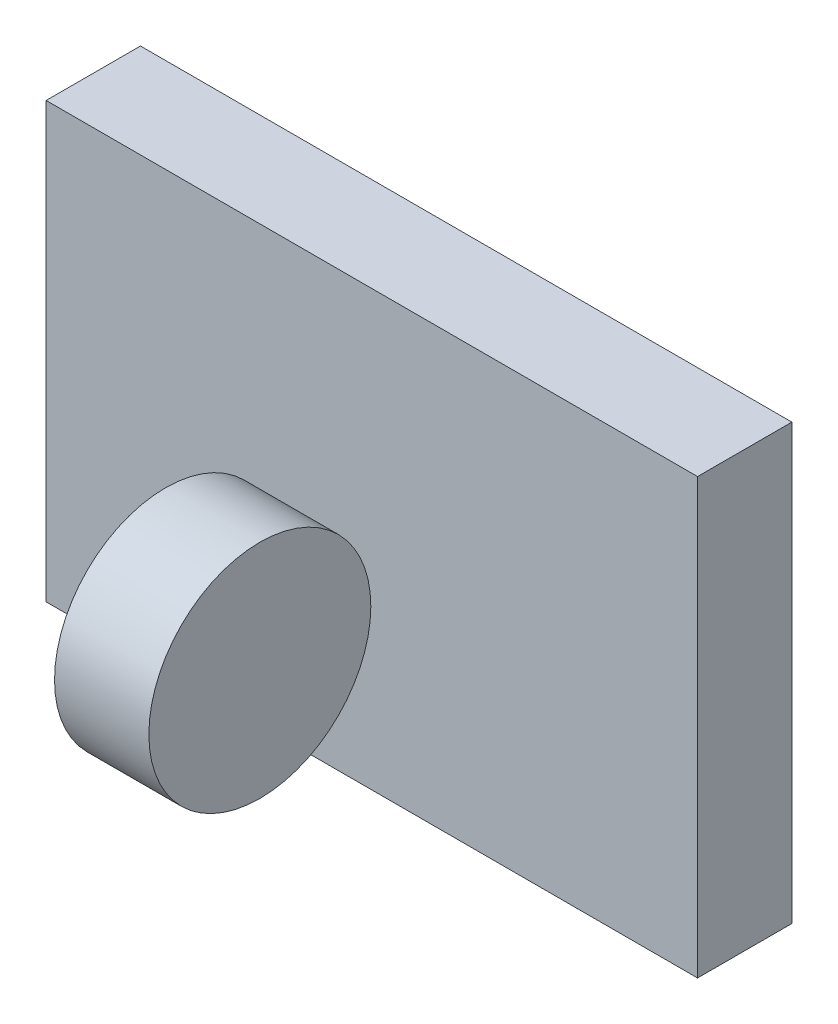
ISO-10303-21;
HEADER;
FILE_DESCRIPTION(('STEP AP214'),'2;1');
FILE_NAME('part.step','',(''),(''),'','','');
FILE_SCHEMA(('AUTOMOTIVE_DESIGN { 1 0 10303 214 1 1 1 1 }'));
ENDSEC;
DATA;
#1=APPLICATION_CONTEXT('core data for automotive mechanical design processes');
#2=APPLICATION_PROTOCOL_DEFINITION('international standard','automotive_design',2000,#1);
#3=PRODUCT_CONTEXT('',#1,'mechanical');
#4=PRODUCT('Part','Part','',(#3));
#5=PRODUCT_RELATED_PRODUCT_CATEGORY('part','',(#4));
#6=PRODUCT_DEFINITION_FORMATION('','',#4);
#7=PRODUCT_DEFINITION_CONTEXT('part definition',#1,'design');
#8=PRODUCT_DEFINITION('design','',#6,#7);
#9=PRODUCT_DEFINITION_SHAPE('','',#8);
#10=(LENGTH_UNIT() NAMED_UNIT(*) SI_UNIT(.MILLI.,.METRE.));
#11=(NAMED_UNIT(*) PLANE_ANGLE_UNIT() SI_UNIT($,.RADIAN.));
#12=(NAMED_UNIT(*) SI_UNIT($,.STERADIAN.) SOLID_ANGLE_UNIT());
#13=UNCERTAINTY_MEASURE_WITH_UNIT(LENGTH_MEASURE(1.E-05),#10,'distance_accuracy_value','');
#14=(GEOMETRIC_REPRESENTATION_CONTEXT(3) GLOBAL_UNCERTAINTY_ASSIGNED_CONTEXT((#13)) GLOBAL_UNIT_ASSIGNED_CONTEXT((#10,
#11,#12)) REPRESENTATION_CONTEXT('',''));
#15=CARTESIAN_POINT('',(0.,0.,0.));
#16=DIRECTION('',(0.,0.,1.));
#17=DIRECTION('',(1.,0.,0.));
#18=AXIS2_PLACEMENT_3D('',#15,#16,#17);
#19=CARTESIAN_POINT('',(10.,0.,19.7500289399848));
#20=DIRECTION('',(-1.,0.,0.));
#21=DIRECTION('',(0.,0.,1.));
#22=AXIS2_PLACEMENT_3D('',#19,#20,#21);
#23=CYLINDRICAL_SURFACE('',#22,11.76735074313);
#24=CARTESIAN_POINT('',(10.,0.,19.7500289399848));
#25=DIRECTION('',(1.,0.,0.));
#26=DIRECTION('',(0.,0.,-1.));
#27=AXIS2_PLACEMENT_3D('',#24,#25,#26);
#28=CIRCLE('',#27,11.76735074313);
#29=CARTESIAN_POINT('',(10.,0.,7.98267819685481));
#30=VERTEX_POINT('',#29);
#31=EDGE_CURVE('E11',#30,#30,#28,.T.);
#32=ORIENTED_EDGE('',*,*,#31,.F.);
#33=EDGE_LOOP('',(#32));
#34=FACE_BOUND('',#33,.T.);
#35=CARTESIAN_POINT('',(0.,0.,19.7500289399848));
#36=DIRECTION('',(1.,0.,0.));
#37=DIRECTION('',(0.,0.,-1.));
#38=AXIS2_PLACEMENT_3D('',#35,#36,#37);
#39=CIRCLE('',#38,11.76735074313);
#40=CARTESIAN_POINT('',(0.,0.,7.98267819685481));
#41=VERTEX_POINT('',#40);
#42=EDGE_CURVE('E48',#41,#41,#39,.T.);
#43=ORIENTED_EDGE('',*,*,#42,.T.);
#44=EDGE_LOOP('',(#43));
#45=FACE_BOUND('',#44,.T.);
#46=ADVANCED_FACE('F45',(#34,#45),#23,.T.);
#47=CARTESIAN_POINT('',(10.,0.,19.7500289399848));
#48=DIRECTION('',(1.,0.,0.));
#49=DIRECTION('',(0.,0.,-1.));
#50=AXIS2_PLACEMENT_3D('',#47,#48,#49);
#51=PLANE('',#50);
#52=ORIENTED_EDGE('',*,*,#31,.T.);
#53=EDGE_LOOP('',(#52));
#54=FACE_BOUND('',#53,.T.);
#55=ADVANCED_FACE('F60',(#54),#51,.T.);
#56=CARTESIAN_POINT('',(0.,0.,19.7500289399848));
#57=DIRECTION('',(1.,0.,0.));
#58=DIRECTION('',(0.,0.,-1.));
#59=AXIS2_PLACEMENT_3D('',#56,#57,#58);
#60=PLANE('',#59);
#61=ORIENTED_EDGE('',*,*,#42,.F.);
#62=EDGE_LOOP('',(#61));
#63=FACE_BOUND('',#62,.T.);
#64=ADVANCED_FACE('F58',(#63),#60,.F.);
#65=CLOSED_SHELL('',(#46,#55,#64));
#66=MANIFOLD_SOLID_BREP('B2',#65);
#67=CARTESIAN_POINT('',(-32.4073170430545,21.2506997003636,-10.));
#68=DIRECTION('',(-1.,0.,0.));
#69=DIRECTION('',(0.,0.,1.));
#70=AXIS2_PLACEMENT_3D('',#67,#68,#69);
#71=PLANE('',#70);
#72=DIRECTION('',(0.,-1.,0.));
#73=VECTOR('',#72,1.);
#74=CARTESIAN_POINT('',(-32.4073170430545,21.2506997003636,0.));
#75=LINE('',#74,#73);
#76=CARTESIAN_POINT('',(-32.4073170430545,21.2506997003636,0.));
#77=VERTEX_POINT('',#76);
#78=CARTESIAN_POINT('',(-32.4073170430545,-24.7924829837576,0.));
#79=VERTEX_POINT('',#78);
#80=EDGE_CURVE('E150',#77,#79,#75,.T.);
#81=ORIENTED_EDGE('',*,*,#80,.F.);
#82=DIRECTION('',(0.,0.,1.));
#83=VECTOR('',#82,1.);
#84=CARTESIAN_POINT('',(-32.4073170430545,21.2506997003636,-10.));
#85=LINE('',#84,#83);
#86=CARTESIAN_POINT('',(-32.4073170430545,21.2506997003636,-10.));
#87=VERTEX_POINT('',#86);
#88=EDGE_CURVE('E43',#87,#77,#85,.T.);
#89=ORIENTED_EDGE('',*,*,#88,.F.);
#90=DIRECTION('',(0.,-1.,0.));
#91=VECTOR('',#90,1.);
#92=CARTESIAN_POINT('',(-32.4073170430545,21.2506997003636,-10.));
#93=LINE('',#92,#91);
#94=CARTESIAN_POINT('',(-32.4073170430545,-24.7924829837576,-10.));
#95=VERTEX_POINT('',#94);
#96=EDGE_CURVE('E144',#87,#95,#93,.T.);
#97=ORIENTED_EDGE('',*,*,#96,.T.);
#98=DIRECTION('',(0.,0.,1.));
#99=VECTOR('',#98,1.);
#100=CARTESIAN_POINT('',(-32.4073170430545,-24.7924829837576,-10.));
#101=LINE('',#100,#99);
#102=EDGE_CURVE('E89',#95,#79,#101,.T.);
#103=ORIENTED_EDGE('',*,*,#102,.T.);
#104=EDGE_LOOP('',(#81,#89,#97,#103));
#105=FACE_BOUND('',#104,.T.);
#106=ADVANCED_FACE('F86',(#105),#71,.T.);
#107=CARTESIAN_POINT('',(-32.4073170430545,21.2506997003636,-10.));
#108=DIRECTION('',(0.,1.,0.));
#109=DIRECTION('',(0.,0.,1.));
#110=AXIS2_PLACEMENT_3D('',#107,#108,#109);
#111=PLANE('',#110);
#112=DIRECTION('',(-1.,0.,0.));
#113=VECTOR('',#112,1.);
#114=CARTESIAN_POINT('',(-32.4073170430545,21.2506997003636,0.));
#115=LINE('',#114,#113);
#116=CARTESIAN_POINT('',(36.6574569831272,21.2506997003636,0.));
#117=VERTEX_POINT('',#116);
#118=EDGE_CURVE('E146',#117,#77,#115,.T.);
#119=ORIENTED_EDGE('',*,*,#118,.F.);
#120=DIRECTION('',(0.,0.,1.));
#121=VECTOR('',#120,1.);
#122=CARTESIAN_POINT('',(36.6574569831272,21.2506997003636,-10.));
#123=LINE('',#122,#121);
#124=CARTESIAN_POINT('',(36.6574569831272,21.2506997003636,-10.));
#125=VERTEX_POINT('',#124);
#126=EDGE_CURVE('E95',#125,#117,#123,.T.);
#127=ORIENTED_EDGE('',*,*,#126,.F.);
#128=DIRECTION('',(-1.,0.,0.));
#129=VECTOR('',#128,1.);
#130=CARTESIAN_POINT('',(-32.4073170430545,21.2506997003636,-10.));
#131=LINE('',#130,#129);
#132=EDGE_CURVE('E141',#125,#87,#131,.T.);
#133=ORIENTED_EDGE('',*,*,#132,.T.);
#134=ORIENTED_EDGE('',*,*,#88,.T.);
#135=EDGE_LOOP('',(#119,#127,#133,#134));
#136=FACE_BOUND('',#135,.T.);
#137=ADVANCED_FACE('F160',(#136),#111,.T.);
#138=CARTESIAN_POINT('',(36.6574569831272,21.2506997003636,-10.));
#139=DIRECTION('',(1.,0.,0.));
#140=DIRECTION('',(0.,0.,-1.));
#141=AXIS2_PLACEMENT_3D('',#138,#139,#140);
#142=PLANE('',#141);
#143=DIRECTION('',(0.,1.,0.));
#144=VECTOR('',#143,1.);
#145=CARTESIAN_POINT('',(36.6574569831272,21.2506997003636,0.));
#146=LINE('',#145,#144);
#147=CARTESIAN_POINT('',(36.6574569831272,-24.7924829837576,0.));
#148=VERTEX_POINT('',#147);
#149=EDGE_CURVE('E136',#148,#117,#146,.T.);
#150=ORIENTED_EDGE('',*,*,#149,.F.);
#151=DIRECTION('',(0.,0.,1.));
#152=VECTOR('',#151,1.);
#153=CARTESIAN_POINT('',(36.6574569831272,-24.7924829837576,-10.));
#154=LINE('',#153,#152);
#155=CARTESIAN_POINT('',(36.6574569831272,-24.7924829837576,-10.));
#156=VERTEX_POINT('',#155);
#157=EDGE_CURVE('E131',#156,#148,#154,.T.);
#158=ORIENTED_EDGE('',*,*,#157,.F.);
#159=DIRECTION('',(0.,1.,0.));
#160=VECTOR('',#159,1.);
#161=CARTESIAN_POINT('',(36.6574569831272,21.2506997003636,-10.));
#162=LINE('',#161,#160);
#163=EDGE_CURVE('E134',#156,#125,#162,.T.);
#164=ORIENTED_EDGE('',*,*,#163,.T.);
#165=ORIENTED_EDGE('',*,*,#126,.T.);
#166=EDGE_LOOP('',(#150,#158,#164,#165));
#167=FACE_BOUND('',#166,.T.);
#168=ADVANCED_FACE('F133',(#167),#142,.T.);
#169=CARTESIAN_POINT('',(-32.4073170430545,-24.7924829837576,-10.));
#170=DIRECTION('',(0.,-1.,0.));
#171=DIRECTION('',(0.,0.,-1.));
#172=AXIS2_PLACEMENT_3D('',#169,#170,#171);
#173=PLANE('',#172);
#174=DIRECTION('',(1.,0.,0.));
#175=VECTOR('',#174,1.);
#176=CARTESIAN_POINT('',(-32.4073170430545,-24.7924829837576,0.));
#177=LINE('',#176,#175);
#178=EDGE_CURVE('E153',#79,#148,#177,.T.);
#179=ORIENTED_EDGE('',*,*,#178,.F.);
#180=ORIENTED_EDGE('',*,*,#102,.F.);
#181=DIRECTION('',(1.,0.,0.));
#182=VECTOR('',#181,1.);
#183=CARTESIAN_POINT('',(-32.4073170430545,-24.7924829837576,-10.));
#184=LINE('',#183,#182);
#185=EDGE_CURVE('E140',#95,#156,#184,.T.);
#186=ORIENTED_EDGE('',*,*,#185,.T.);
#187=ORIENTED_EDGE('',*,*,#157,.T.);
#188=EDGE_LOOP('',(#179,#180,#186,#187));
#189=FACE_BOUND('',#188,.T.);
#190=ADVANCED_FACE('F143',(#189),#173,.T.);
#191=CARTESIAN_POINT('',(0.,0.,-10.));
#192=DIRECTION('',(0.,0.,1.));
#193=DIRECTION('',(1.,0.,0.));
#194=AXIS2_PLACEMENT_3D('',#191,#192,#193);
#195=PLANE('',#194);
#196=ORIENTED_EDGE('',*,*,#96,.F.);
#197=ORIENTED_EDGE('',*,*,#132,.F.);
#198=ORIENTED_EDGE('',*,*,#163,.F.);
#199=ORIENTED_EDGE('',*,*,#185,.F.);
#200=EDGE_LOOP('',(#196,#197,#198,#199));
#201=FACE_BOUND('',#200,.T.);
#202=ADVANCED_FACE('F139',(#201),#195,.F.);
#203=CARTESIAN_POINT('',(0.,0.,0.));
#204=DIRECTION('',(0.,0.,1.));
#205=DIRECTION('',(1.,0.,0.));
#206=AXIS2_PLACEMENT_3D('',#203,#204,#205);
#207=PLANE('',#206);
#208=ORIENTED_EDGE('',*,*,#80,.T.);
#209=ORIENTED_EDGE('',*,*,#178,.T.);
#210=ORIENTED_EDGE('',*,*,#149,.T.);
#211=ORIENTED_EDGE('',*,*,#118,.T.);
#212=EDGE_LOOP('',(#208,#209,#210,#211));
#213=FACE_BOUND('',#212,.T.);
#214=ADVANCED_FACE('F159',(#213),#207,.T.);
#215=CLOSED_SHELL('',(#106,#137,#168,#190,#202,#214));
#216=MANIFOLD_SOLID_BREP('B6',#215);
#217=ADVANCED_BREP_SHAPE_REPRESENTATION('',(#18,#66,#216),#14);
#218=SHAPE_DEFINITION_REPRESENTATION(#9,#217);
ENDSEC;
END-ISO-10303-21;
